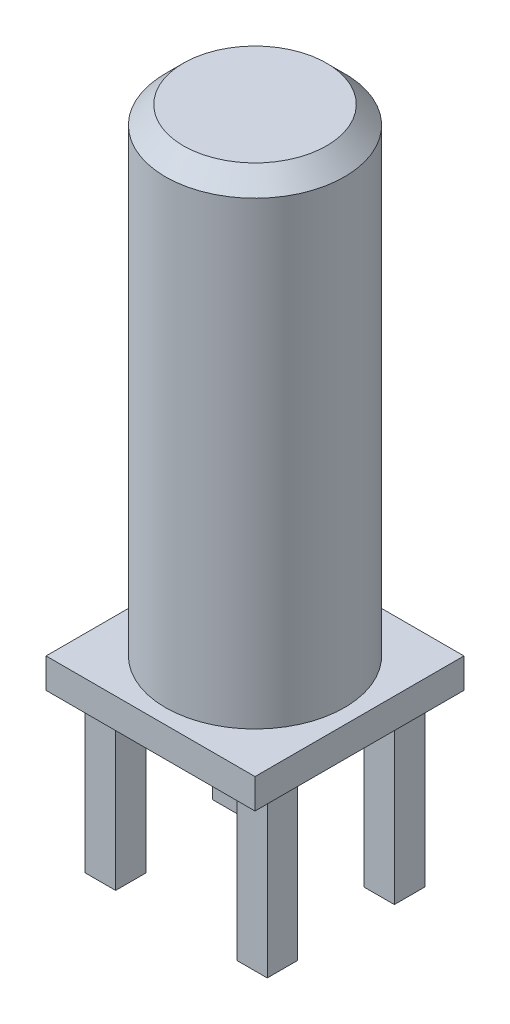
ISO-10303-21;
HEADER;
FILE_DESCRIPTION(('STEP AP214'),'2;1');
FILE_NAME('part.step','',(''),(''),'','','');
FILE_SCHEMA(('AUTOMOTIVE_DESIGN { 1 0 10303 214 1 1 1 1 }'));
ENDSEC;
DATA;
#1=APPLICATION_CONTEXT('core data for automotive mechanical design processes');
#2=APPLICATION_PROTOCOL_DEFINITION('international standard','automotive_design',2000,#1);
#3=PRODUCT_CONTEXT('',#1,'mechanical');
#4=PRODUCT('Part','Part','',(#3));
#5=PRODUCT_RELATED_PRODUCT_CATEGORY('part','',(#4));
#6=PRODUCT_DEFINITION_FORMATION('','',#4);
#7=PRODUCT_DEFINITION_CONTEXT('part definition',#1,'design');
#8=PRODUCT_DEFINITION('design','',#6,#7);
#9=PRODUCT_DEFINITION_SHAPE('','',#8);
#10=(LENGTH_UNIT() NAMED_UNIT(*) SI_UNIT(.MILLI.,.METRE.));
#11=(NAMED_UNIT(*) PLANE_ANGLE_UNIT() SI_UNIT($,.RADIAN.));
#12=(NAMED_UNIT(*) SI_UNIT($,.STERADIAN.) SOLID_ANGLE_UNIT());
#13=UNCERTAINTY_MEASURE_WITH_UNIT(LENGTH_MEASURE(1.E-05),#10,'distance_accuracy_value','');
#14=(GEOMETRIC_REPRESENTATION_CONTEXT(3) GLOBAL_UNCERTAINTY_ASSIGNED_CONTEXT((#13)) GLOBAL_UNIT_ASSIGNED_CONTEXT((#10,
#11,#12)) REPRESENTATION_CONTEXT('',''));
#15=CARTESIAN_POINT('',(0.,0.,0.));
#16=DIRECTION('',(0.,0.,1.));
#17=DIRECTION('',(1.,0.,0.));
#18=AXIS2_PLACEMENT_3D('',#15,#16,#17);
#19=CARTESIAN_POINT('',(0.,0.,0.));
#20=DIRECTION('',(0.,1.,0.));
#21=DIRECTION('',(0.,0.,1.));
#22=AXIS2_PLACEMENT_3D('',#19,#20,#21);
#23=PLANE('',#22);
#24=DIRECTION('',(0.,0.,-1.));
#25=VECTOR('',#24,1.);
#26=CARTESIAN_POINT('',(2.03,0.,2.6395086139136));
#27=LINE('',#26,#25);
#28=CARTESIAN_POINT('',(2.03,0.,2.6395086139136));
#29=VERTEX_POINT('',#28);
#30=CARTESIAN_POINT('',(2.03,0.,1.6195086139136));
#31=VERTEX_POINT('',#30);
#32=EDGE_CURVE('E204',#29,#31,#27,.T.);
#33=ORIENTED_EDGE('',*,*,#32,.F.);
#34=DIRECTION('',(-1.,0.,0.));
#35=VECTOR('',#34,1.);
#36=CARTESIAN_POINT('',(2.03,0.,2.6395086139136));
#37=LINE('',#36,#35);
#38=CARTESIAN_POINT('',(3.05,0.,2.6395086139136));
#39=VERTEX_POINT('',#38);
#40=EDGE_CURVE('E217',#39,#29,#37,.T.);
#41=ORIENTED_EDGE('',*,*,#40,.F.);
#42=DIRECTION('',(0.,0.,1.));
#43=VECTOR('',#42,1.);
#44=CARTESIAN_POINT('',(3.05,0.,2.6395086139136));
#45=LINE('',#44,#43);
#46=CARTESIAN_POINT('',(3.05,0.,1.6195086139136));
#47=VERTEX_POINT('',#46);
#48=EDGE_CURVE('E226',#47,#39,#45,.T.);
#49=ORIENTED_EDGE('',*,*,#48,.F.);
#50=DIRECTION('',(1.,0.,0.));
#51=VECTOR('',#50,1.);
#52=CARTESIAN_POINT('',(2.03,0.,1.6195086139136));
#53=LINE('',#52,#51);
#54=EDGE_CURVE('E207',#31,#47,#53,.T.);
#55=ORIENTED_EDGE('',*,*,#54,.F.);
#56=EDGE_LOOP('',(#33,#41,#49,#55));
#57=FACE_BOUND('',#56,.T.);
#58=DIRECTION('',(0.,0.,-1.));
#59=VECTOR('',#58,1.);
#60=CARTESIAN_POINT('',(-3.05,0.,2.6395086139136));
#61=LINE('',#60,#59);
#62=CARTESIAN_POINT('',(-3.05,0.,2.6395086139136));
#63=VERTEX_POINT('',#62);
#64=CARTESIAN_POINT('',(-3.05,0.,1.6195086139136));
#65=VERTEX_POINT('',#64);
#66=EDGE_CURVE('E275',#63,#65,#61,.T.);
#67=ORIENTED_EDGE('',*,*,#66,.F.);
#68=DIRECTION('',(-1.,0.,0.));
#69=VECTOR('',#68,1.);
#70=CARTESIAN_POINT('',(-3.05,0.,2.6395086139136));
#71=LINE('',#70,#69);
#72=CARTESIAN_POINT('',(-2.03,0.,2.6395086139136));
#73=VERTEX_POINT('',#72);
#74=EDGE_CURVE('E280',#73,#63,#71,.T.);
#75=ORIENTED_EDGE('',*,*,#74,.F.);
#76=DIRECTION('',(0.,0.,1.));
#77=VECTOR('',#76,1.);
#78=CARTESIAN_POINT('',(-2.03,0.,2.6395086139136));
#79=LINE('',#78,#77);
#80=CARTESIAN_POINT('',(-2.03,0.,1.6195086139136));
#81=VERTEX_POINT('',#80);
#82=EDGE_CURVE('E292',#81,#73,#79,.T.);
#83=ORIENTED_EDGE('',*,*,#82,.F.);
#84=DIRECTION('',(1.,0.,0.));
#85=VECTOR('',#84,1.);
#86=CARTESIAN_POINT('',(-3.05,0.,1.6195086139136));
#87=LINE('',#86,#85);
#88=EDGE_CURVE('E289',#65,#81,#87,.T.);
#89=ORIENTED_EDGE('',*,*,#88,.F.);
#90=EDGE_LOOP('',(#67,#75,#83,#89));
#91=FACE_BOUND('',#90,.T.);
#92=DIRECTION('',(0.,0.,-1.));
#93=VECTOR('',#92,1.);
#94=CARTESIAN_POINT('',(3.5,0.,-3.5));
#95=LINE('',#94,#93);
#96=CARTESIAN_POINT('',(3.5,0.,3.5));
#97=VERTEX_POINT('',#96);
#98=CARTESIAN_POINT('',(3.5,0.,-3.5));
#99=VERTEX_POINT('',#98);
#100=EDGE_CURVE('E308',#97,#99,#95,.T.);
#101=ORIENTED_EDGE('',*,*,#100,.F.);
#102=DIRECTION('',(1.,0.,0.));
#103=VECTOR('',#102,1.);
#104=CARTESIAN_POINT('',(-3.5,0.,3.5));
#105=LINE('',#104,#103);
#106=CARTESIAN_POINT('',(-3.5,0.,3.5));
#107=VERTEX_POINT('',#106);
#108=EDGE_CURVE('E313',#107,#97,#105,.T.);
#109=ORIENTED_EDGE('',*,*,#108,.F.);
#110=DIRECTION('',(0.,0.,1.));
#111=VECTOR('',#110,1.);
#112=CARTESIAN_POINT('',(-3.5,0.,-3.5));
#113=LINE('',#112,#111);
#114=CARTESIAN_POINT('',(-3.5,0.,-3.5));
#115=VERTEX_POINT('',#114);
#116=EDGE_CURVE('E324',#115,#107,#113,.T.);
#117=ORIENTED_EDGE('',*,*,#116,.F.);
#118=DIRECTION('',(-1.,0.,0.));
#119=VECTOR('',#118,1.);
#120=CARTESIAN_POINT('',(-3.5,0.,-3.5));
#121=LINE('',#120,#119);
#122=EDGE_CURVE('E322',#99,#115,#121,.T.);
#123=ORIENTED_EDGE('',*,*,#122,.F.);
#124=EDGE_LOOP('',(#101,#109,#117,#123));
#125=FACE_BOUND('',#124,.T.);
#126=DIRECTION('',(0.,0.,-1.));
#127=VECTOR('',#126,1.);
#128=CARTESIAN_POINT('',(-3.05,0.,-1.6195086139136));
#129=LINE('',#128,#127);
#130=CARTESIAN_POINT('',(-3.05,0.,-1.6195086139136));
#131=VERTEX_POINT('',#130);
#132=CARTESIAN_POINT('',(-3.05,0.,-2.6395086139136));
#133=VERTEX_POINT('',#132);
#134=EDGE_CURVE('E242',#131,#133,#129,.T.);
#135=ORIENTED_EDGE('',*,*,#134,.F.);
#136=DIRECTION('',(-1.,0.,0.));
#137=VECTOR('',#136,1.);
#138=CARTESIAN_POINT('',(-3.05,0.,-1.6195086139136));
#139=LINE('',#138,#137);
#140=CARTESIAN_POINT('',(-2.03,0.,-1.6195086139136));
#141=VERTEX_POINT('',#140);
#142=EDGE_CURVE('E247',#141,#131,#139,.T.);
#143=ORIENTED_EDGE('',*,*,#142,.F.);
#144=DIRECTION('',(0.,0.,1.));
#145=VECTOR('',#144,1.);
#146=CARTESIAN_POINT('',(-2.03,0.,-1.6195086139136));
#147=LINE('',#146,#145);
#148=CARTESIAN_POINT('',(-2.03,0.,-2.6395086139136));
#149=VERTEX_POINT('',#148);
#150=EDGE_CURVE('E259',#149,#141,#147,.T.);
#151=ORIENTED_EDGE('',*,*,#150,.F.);
#152=DIRECTION('',(1.,0.,0.));
#153=VECTOR('',#152,1.);
#154=CARTESIAN_POINT('',(-3.05,0.,-2.6395086139136));
#155=LINE('',#154,#153);
#156=EDGE_CURVE('E256',#133,#149,#155,.T.);
#157=ORIENTED_EDGE('',*,*,#156,.F.);
#158=EDGE_LOOP('',(#135,#143,#151,#157));
#159=FACE_BOUND('',#158,.T.);
#160=DIRECTION('',(0.,0.,-1.));
#161=VECTOR('',#160,1.);
#162=CARTESIAN_POINT('',(2.03,0.,-1.6195086139136));
#163=LINE('',#162,#161);
#164=CARTESIAN_POINT('',(2.03,0.,-1.6195086139136));
#165=VERTEX_POINT('',#164);
#166=CARTESIAN_POINT('',(2.03,0.,-2.6395086139136));
#167=VERTEX_POINT('',#166);
#168=EDGE_CURVE('E203',#165,#167,#163,.T.);
#169=ORIENTED_EDGE('',*,*,#168,.F.);
#170=DIRECTION('',(-1.,0.,0.));
#171=VECTOR('',#170,1.);
#172=CARTESIAN_POINT('',(2.03,0.,-1.6195086139136));
#173=LINE('',#172,#171);
#174=CARTESIAN_POINT('',(3.05,0.,-1.6195086139136));
#175=VERTEX_POINT('',#174);
#176=EDGE_CURVE('E200',#175,#165,#173,.T.);
#177=ORIENTED_EDGE('',*,*,#176,.F.);
#178=DIRECTION('',(0.,0.,1.));
#179=VECTOR('',#178,1.);
#180=CARTESIAN_POINT('',(3.05,0.,-1.6195086139136));
#181=LINE('',#180,#179);
#182=CARTESIAN_POINT('',(3.05,0.,-2.6395086139136));
#183=VERTEX_POINT('',#182);
#184=EDGE_CURVE('E66',#183,#175,#181,.T.);
#185=ORIENTED_EDGE('',*,*,#184,.F.);
#186=DIRECTION('',(1.,0.,0.));
#187=VECTOR('',#186,1.);
#188=CARTESIAN_POINT('',(2.03,0.,-2.6395086139136));
#189=LINE('',#188,#187);
#190=EDGE_CURVE('E61',#167,#183,#189,.T.);
#191=ORIENTED_EDGE('',*,*,#190,.F.);
#192=EDGE_LOOP('',(#169,#177,#185,#191));
#193=FACE_BOUND('',#192,.T.);
#194=ADVANCED_FACE('F46',(#57,#91,#125,#159,#193),#23,.F.);
#195=CARTESIAN_POINT('',(3.5,1.,-3.5));
#196=DIRECTION('',(-1.,0.,0.));
#197=DIRECTION('',(0.,0.,1.));
#198=AXIS2_PLACEMENT_3D('',#195,#196,#197);
#199=PLANE('',#198);
#200=ORIENTED_EDGE('',*,*,#100,.T.);
#201=DIRECTION('',(0.,-1.,0.));
#202=VECTOR('',#201,1.);
#203=CARTESIAN_POINT('',(3.5,1.,-3.5));
#204=LINE('',#203,#202);
#205=CARTESIAN_POINT('',(3.5,1.,-3.5));
#206=VERTEX_POINT('',#205);
#207=EDGE_CURVE('E335',#206,#99,#204,.T.);
#208=ORIENTED_EDGE('',*,*,#207,.F.);
#209=DIRECTION('',(0.,0.,-1.));
#210=VECTOR('',#209,1.);
#211=CARTESIAN_POINT('',(3.5,1.,-3.5));
#212=LINE('',#211,#210);
#213=CARTESIAN_POINT('',(3.5,1.,3.5));
#214=VERTEX_POINT('',#213);
#215=EDGE_CURVE('E309',#214,#206,#212,.T.);
#216=ORIENTED_EDGE('',*,*,#215,.F.);
#217=DIRECTION('',(0.,-1.,0.));
#218=VECTOR('',#217,1.);
#219=CARTESIAN_POINT('',(3.5,1.,3.5));
#220=LINE('',#219,#218);
#221=EDGE_CURVE('E319',#214,#97,#220,.T.);
#222=ORIENTED_EDGE('',*,*,#221,.T.);
#223=EDGE_LOOP('',(#200,#208,#216,#222));
#224=FACE_BOUND('',#223,.T.);
#225=ADVANCED_FACE('F369',(#224),#199,.F.);
#226=CARTESIAN_POINT('',(-3.5,1.,-3.5));
#227=DIRECTION('',(0.,0.,1.));
#228=DIRECTION('',(1.,0.,0.));
#229=AXIS2_PLACEMENT_3D('',#226,#227,#228);
#230=PLANE('',#229);
#231=ORIENTED_EDGE('',*,*,#122,.T.);
#232=DIRECTION('',(0.,-1.,0.));
#233=VECTOR('',#232,1.);
#234=CARTESIAN_POINT('',(-3.5,1.,-3.5));
#235=LINE('',#234,#233);
#236=CARTESIAN_POINT('',(-3.5,1.,-3.5));
#237=VERTEX_POINT('',#236);
#238=EDGE_CURVE('E332',#237,#115,#235,.T.);
#239=ORIENTED_EDGE('',*,*,#238,.F.);
#240=DIRECTION('',(-1.,0.,0.));
#241=VECTOR('',#240,1.);
#242=CARTESIAN_POINT('',(-3.5,1.,-3.5));
#243=LINE('',#242,#241);
#244=EDGE_CURVE('E312',#206,#237,#243,.T.);
#245=ORIENTED_EDGE('',*,*,#244,.F.);
#246=ORIENTED_EDGE('',*,*,#207,.T.);
#247=EDGE_LOOP('',(#231,#239,#245,#246));
#248=FACE_BOUND('',#247,.T.);
#249=ADVANCED_FACE('F375',(#248),#230,.F.);
#250=CARTESIAN_POINT('',(-3.5,1.,-3.5));
#251=DIRECTION('',(1.,0.,0.));
#252=DIRECTION('',(0.,0.,-1.));
#253=AXIS2_PLACEMENT_3D('',#250,#251,#252);
#254=PLANE('',#253);
#255=ORIENTED_EDGE('',*,*,#116,.T.);
#256=DIRECTION('',(0.,-1.,0.));
#257=VECTOR('',#256,1.);
#258=CARTESIAN_POINT('',(-3.5,1.,3.5));
#259=LINE('',#258,#257);
#260=CARTESIAN_POINT('',(-3.5,1.,3.5));
#261=VERTEX_POINT('',#260);
#262=EDGE_CURVE('E329',#261,#107,#259,.T.);
#263=ORIENTED_EDGE('',*,*,#262,.F.);
#264=DIRECTION('',(0.,0.,1.));
#265=VECTOR('',#264,1.);
#266=CARTESIAN_POINT('',(-3.5,1.,-3.5));
#267=LINE('',#266,#265);
#268=EDGE_CURVE('E315',#237,#261,#267,.T.);
#269=ORIENTED_EDGE('',*,*,#268,.F.);
#270=ORIENTED_EDGE('',*,*,#238,.T.);
#271=EDGE_LOOP('',(#255,#263,#269,#270));
#272=FACE_BOUND('',#271,.T.);
#273=ADVANCED_FACE('F385',(#272),#254,.F.);
#274=CARTESIAN_POINT('',(-3.5,1.,3.5));
#275=DIRECTION('',(0.,0.,-1.));
#276=DIRECTION('',(-1.,0.,0.));
#277=AXIS2_PLACEMENT_3D('',#274,#275,#276);
#278=PLANE('',#277);
#279=ORIENTED_EDGE('',*,*,#108,.T.);
#280=ORIENTED_EDGE('',*,*,#221,.F.);
#281=DIRECTION('',(1.,0.,0.));
#282=VECTOR('',#281,1.);
#283=CARTESIAN_POINT('',(-3.5,1.,3.5));
#284=LINE('',#283,#282);
#285=EDGE_CURVE('E317',#261,#214,#284,.T.);
#286=ORIENTED_EDGE('',*,*,#285,.F.);
#287=ORIENTED_EDGE('',*,*,#262,.T.);
#288=EDGE_LOOP('',(#279,#280,#286,#287));
#289=FACE_BOUND('',#288,.T.);
#290=ADVANCED_FACE('F382',(#289),#278,.F.);
#291=CARTESIAN_POINT('',(0.,1.,0.));
#292=DIRECTION('',(0.,1.,0.));
#293=DIRECTION('',(0.,0.,1.));
#294=AXIS2_PLACEMENT_3D('',#291,#292,#293);
#295=PLANE('',#294);
#296=CARTESIAN_POINT('',(0.,1.,0.));
#297=DIRECTION('',(0.,1.,0.));
#298=DIRECTION('',(0.,0.,1.));
#299=AXIS2_PLACEMENT_3D('',#296,#297,#298);
#300=CIRCLE('',#299,3.);
#301=CARTESIAN_POINT('',(0.,1.,3.));
#302=VERTEX_POINT('',#301);
#303=EDGE_CURVE('E337',#302,#302,#300,.T.);
#304=ORIENTED_EDGE('',*,*,#303,.F.);
#305=EDGE_LOOP('',(#304));
#306=FACE_BOUND('',#305,.T.);
#307=ORIENTED_EDGE('',*,*,#215,.T.);
#308=ORIENTED_EDGE('',*,*,#244,.T.);
#309=ORIENTED_EDGE('',*,*,#268,.T.);
#310=ORIENTED_EDGE('',*,*,#285,.T.);
#311=EDGE_LOOP('',(#307,#308,#309,#310));
#312=FACE_BOUND('',#311,.T.);
#313=ADVANCED_FACE('F380',(#306,#312),#295,.T.);
#314=CARTESIAN_POINT('',(-3.05,-5.5,2.6395086139136));
#315=DIRECTION('',(1.,0.,0.));
#316=DIRECTION('',(0.,0.,-1.));
#317=AXIS2_PLACEMENT_3D('',#314,#315,#316);
#318=PLANE('',#317);
#319=ORIENTED_EDGE('',*,*,#66,.T.);
#320=DIRECTION('',(0.,1.,0.));
#321=VECTOR('',#320,1.);
#322=CARTESIAN_POINT('',(-3.05,-5.5,1.6195086139136));
#323=LINE('',#322,#321);
#324=CARTESIAN_POINT('',(-3.05,-5.5,1.6195086139136));
#325=VERTEX_POINT('',#324);
#326=EDGE_CURVE('E305',#325,#65,#323,.T.);
#327=ORIENTED_EDGE('',*,*,#326,.F.);
#328=DIRECTION('',(0.,0.,-1.));
#329=VECTOR('',#328,1.);
#330=CARTESIAN_POINT('',(-3.05,-5.5,2.6395086139136));
#331=LINE('',#330,#329);
#332=CARTESIAN_POINT('',(-3.05,-5.5,2.6395086139136));
#333=VERTEX_POINT('',#332);
#334=EDGE_CURVE('E276',#333,#325,#331,.T.);
#335=ORIENTED_EDGE('',*,*,#334,.F.);
#336=DIRECTION('',(0.,1.,0.));
#337=VECTOR('',#336,1.);
#338=CARTESIAN_POINT('',(-3.05,-5.5,2.6395086139136));
#339=LINE('',#338,#337);
#340=EDGE_CURVE('E286',#333,#63,#339,.T.);
#341=ORIENTED_EDGE('',*,*,#340,.T.);
#342=EDGE_LOOP('',(#319,#327,#335,#341));
#343=FACE_BOUND('',#342,.T.);
#344=ADVANCED_FACE('F408',(#343),#318,.F.);
#345=CARTESIAN_POINT('',(-3.05,-5.5,1.6195086139136));
#346=DIRECTION('',(0.,0.,1.));
#347=DIRECTION('',(1.,0.,0.));
#348=AXIS2_PLACEMENT_3D('',#345,#346,#347);
#349=PLANE('',#348);
#350=ORIENTED_EDGE('',*,*,#88,.T.);
#351=DIRECTION('',(0.,1.,0.));
#352=VECTOR('',#351,1.);
#353=CARTESIAN_POINT('',(-2.03,-5.5,1.6195086139136));
#354=LINE('',#353,#352);
#355=CARTESIAN_POINT('',(-2.03,-5.5,1.6195086139136));
#356=VERTEX_POINT('',#355);
#357=EDGE_CURVE('E302',#356,#81,#354,.T.);
#358=ORIENTED_EDGE('',*,*,#357,.F.);
#359=DIRECTION('',(1.,0.,0.));
#360=VECTOR('',#359,1.);
#361=CARTESIAN_POINT('',(-3.05,-5.5,1.6195086139136));
#362=LINE('',#361,#360);
#363=EDGE_CURVE('E279',#325,#356,#362,.T.);
#364=ORIENTED_EDGE('',*,*,#363,.F.);
#365=ORIENTED_EDGE('',*,*,#326,.T.);
#366=EDGE_LOOP('',(#350,#358,#364,#365));
#367=FACE_BOUND('',#366,.T.);
#368=ADVANCED_FACE('F413',(#367),#349,.F.);
#369=CARTESIAN_POINT('',(-2.03,-5.5,2.6395086139136));
#370=DIRECTION('',(-1.,0.,0.));
#371=DIRECTION('',(0.,0.,1.));
#372=AXIS2_PLACEMENT_3D('',#369,#370,#371);
#373=PLANE('',#372);
#374=ORIENTED_EDGE('',*,*,#82,.T.);
#375=DIRECTION('',(0.,1.,0.));
#376=VECTOR('',#375,1.);
#377=CARTESIAN_POINT('',(-2.03,-5.5,2.6395086139136));
#378=LINE('',#377,#376);
#379=CARTESIAN_POINT('',(-2.03,-5.5,2.6395086139136));
#380=VERTEX_POINT('',#379);
#381=EDGE_CURVE('E299',#380,#73,#378,.T.);
#382=ORIENTED_EDGE('',*,*,#381,.F.);
#383=DIRECTION('',(0.,0.,1.));
#384=VECTOR('',#383,1.);
#385=CARTESIAN_POINT('',(-2.03,-5.5,2.6395086139136));
#386=LINE('',#385,#384);
#387=EDGE_CURVE('E282',#356,#380,#386,.T.);
#388=ORIENTED_EDGE('',*,*,#387,.F.);
#389=ORIENTED_EDGE('',*,*,#357,.T.);
#390=EDGE_LOOP('',(#374,#382,#388,#389));
#391=FACE_BOUND('',#390,.T.);
#392=ADVANCED_FACE('F418',(#391),#373,.F.);
#393=CARTESIAN_POINT('',(-3.05,-5.5,2.6395086139136));
#394=DIRECTION('',(0.,0.,-1.));
#395=DIRECTION('',(-1.,0.,0.));
#396=AXIS2_PLACEMENT_3D('',#393,#394,#395);
#397=PLANE('',#396);
#398=ORIENTED_EDGE('',*,*,#74,.T.);
#399=ORIENTED_EDGE('',*,*,#340,.F.);
#400=DIRECTION('',(-1.,0.,0.));
#401=VECTOR('',#400,1.);
#402=CARTESIAN_POINT('',(-3.05,-5.5,2.6395086139136));
#403=LINE('',#402,#401);
#404=EDGE_CURVE('E284',#380,#333,#403,.T.);
#405=ORIENTED_EDGE('',*,*,#404,.F.);
#406=ORIENTED_EDGE('',*,*,#381,.T.);
#407=EDGE_LOOP('',(#398,#399,#405,#406));
#408=FACE_BOUND('',#407,.T.);
#409=ADVANCED_FACE('F424',(#408),#397,.F.);
#410=CARTESIAN_POINT('',(0.,-5.5,0.));
#411=DIRECTION('',(0.,-1.,0.));
#412=DIRECTION('',(0.,0.,-1.));
#413=AXIS2_PLACEMENT_3D('',#410,#411,#412);
#414=PLANE('',#413);
#415=ORIENTED_EDGE('',*,*,#334,.T.);
#416=ORIENTED_EDGE('',*,*,#363,.T.);
#417=ORIENTED_EDGE('',*,*,#387,.T.);
#418=ORIENTED_EDGE('',*,*,#404,.T.);
#419=EDGE_LOOP('',(#415,#416,#417,#418));
#420=FACE_BOUND('',#419,.T.);
#421=ADVANCED_FACE('F428',(#420),#414,.T.);
#422=CARTESIAN_POINT('',(-3.05,-5.5,-1.6195086139136));
#423=DIRECTION('',(1.,0.,0.));
#424=DIRECTION('',(0.,0.,-1.));
#425=AXIS2_PLACEMENT_3D('',#422,#423,#424);
#426=PLANE('',#425);
#427=ORIENTED_EDGE('',*,*,#134,.T.);
#428=DIRECTION('',(0.,1.,0.));
#429=VECTOR('',#428,1.);
#430=CARTESIAN_POINT('',(-3.05,-5.5,-2.6395086139136));
#431=LINE('',#430,#429);
#432=CARTESIAN_POINT('',(-3.05,-5.5,-2.6395086139136));
#433=VERTEX_POINT('',#432);
#434=EDGE_CURVE('E272',#433,#133,#431,.T.);
#435=ORIENTED_EDGE('',*,*,#434,.F.);
#436=DIRECTION('',(0.,0.,-1.));
#437=VECTOR('',#436,1.);
#438=CARTESIAN_POINT('',(-3.05,-5.5,-1.6195086139136));
#439=LINE('',#438,#437);
#440=CARTESIAN_POINT('',(-3.05,-5.5,-1.6195086139136));
#441=VERTEX_POINT('',#440);
#442=EDGE_CURVE('E243',#441,#433,#439,.T.);
#443=ORIENTED_EDGE('',*,*,#442,.F.);
#444=DIRECTION('',(0.,1.,0.));
#445=VECTOR('',#444,1.);
#446=CARTESIAN_POINT('',(-3.05,-5.5,-1.6195086139136));
#447=LINE('',#446,#445);
#448=EDGE_CURVE('E253',#441,#131,#447,.T.);
#449=ORIENTED_EDGE('',*,*,#448,.T.);
#450=EDGE_LOOP('',(#427,#435,#443,#449));
#451=FACE_BOUND('',#450,.T.);
#452=ADVANCED_FACE('F432',(#451),#426,.F.);
#453=CARTESIAN_POINT('',(-3.05,-5.5,-2.6395086139136));
#454=DIRECTION('',(0.,0.,1.));
#455=DIRECTION('',(1.,0.,0.));
#456=AXIS2_PLACEMENT_3D('',#453,#454,#455);
#457=PLANE('',#456);
#458=ORIENTED_EDGE('',*,*,#156,.T.);
#459=DIRECTION('',(0.,1.,0.));
#460=VECTOR('',#459,1.);
#461=CARTESIAN_POINT('',(-2.03,-5.5,-2.6395086139136));
#462=LINE('',#461,#460);
#463=CARTESIAN_POINT('',(-2.03,-5.5,-2.6395086139136));
#464=VERTEX_POINT('',#463);
#465=EDGE_CURVE('E269',#464,#149,#462,.T.);
#466=ORIENTED_EDGE('',*,*,#465,.F.);
#467=DIRECTION('',(1.,0.,0.));
#468=VECTOR('',#467,1.);
#469=CARTESIAN_POINT('',(-3.05,-5.5,-2.6395086139136));
#470=LINE('',#469,#468);
#471=EDGE_CURVE('E246',#433,#464,#470,.T.);
#472=ORIENTED_EDGE('',*,*,#471,.F.);
#473=ORIENTED_EDGE('',*,*,#434,.T.);
#474=EDGE_LOOP('',(#458,#466,#472,#473));
#475=FACE_BOUND('',#474,.T.);
#476=ADVANCED_FACE('F436',(#475),#457,.F.);
#477=CARTESIAN_POINT('',(-2.03,-5.5,-1.6195086139136));
#478=DIRECTION('',(-1.,0.,0.));
#479=DIRECTION('',(0.,0.,1.));
#480=AXIS2_PLACEMENT_3D('',#477,#478,#479);
#481=PLANE('',#480);
#482=ORIENTED_EDGE('',*,*,#150,.T.);
#483=DIRECTION('',(0.,1.,0.));
#484=VECTOR('',#483,1.);
#485=CARTESIAN_POINT('',(-2.03,-5.5,-1.6195086139136));
#486=LINE('',#485,#484);
#487=CARTESIAN_POINT('',(-2.03,-5.5,-1.6195086139136));
#488=VERTEX_POINT('',#487);
#489=EDGE_CURVE('E266',#488,#141,#486,.T.);
#490=ORIENTED_EDGE('',*,*,#489,.F.);
#491=DIRECTION('',(0.,0.,1.));
#492=VECTOR('',#491,1.);
#493=CARTESIAN_POINT('',(-2.03,-5.5,-1.6195086139136));
#494=LINE('',#493,#492);
#495=EDGE_CURVE('E249',#464,#488,#494,.T.);
#496=ORIENTED_EDGE('',*,*,#495,.F.);
#497=ORIENTED_EDGE('',*,*,#465,.T.);
#498=EDGE_LOOP('',(#482,#490,#496,#497));
#499=FACE_BOUND('',#498,.T.);
#500=ADVANCED_FACE('F440',(#499),#481,.F.);
#501=CARTESIAN_POINT('',(-3.05,-5.5,-1.6195086139136));
#502=DIRECTION('',(0.,0.,-1.));
#503=DIRECTION('',(-1.,0.,0.));
#504=AXIS2_PLACEMENT_3D('',#501,#502,#503);
#505=PLANE('',#504);
#506=ORIENTED_EDGE('',*,*,#142,.T.);
#507=ORIENTED_EDGE('',*,*,#448,.F.);
#508=DIRECTION('',(-1.,0.,0.));
#509=VECTOR('',#508,1.);
#510=CARTESIAN_POINT('',(-3.05,-5.5,-1.6195086139136));
#511=LINE('',#510,#509);
#512=EDGE_CURVE('E251',#488,#441,#511,.T.);
#513=ORIENTED_EDGE('',*,*,#512,.F.);
#514=ORIENTED_EDGE('',*,*,#489,.T.);
#515=EDGE_LOOP('',(#506,#507,#513,#514));
#516=FACE_BOUND('',#515,.T.);
#517=ADVANCED_FACE('F444',(#516),#505,.F.);
#518=CARTESIAN_POINT('',(0.,-5.5,0.));
#519=DIRECTION('',(0.,-1.,0.));
#520=DIRECTION('',(0.,0.,-1.));
#521=AXIS2_PLACEMENT_3D('',#518,#519,#520);
#522=PLANE('',#521);
#523=ORIENTED_EDGE('',*,*,#442,.T.);
#524=ORIENTED_EDGE('',*,*,#471,.T.);
#525=ORIENTED_EDGE('',*,*,#495,.T.);
#526=ORIENTED_EDGE('',*,*,#512,.T.);
#527=EDGE_LOOP('',(#523,#524,#525,#526));
#528=FACE_BOUND('',#527,.T.);
#529=ADVANCED_FACE('F448',(#528),#522,.T.);
#530=CARTESIAN_POINT('',(2.03,-5.5,2.6395086139136));
#531=DIRECTION('',(1.,0.,0.));
#532=DIRECTION('',(0.,0.,-1.));
#533=AXIS2_PLACEMENT_3D('',#530,#531,#532);
#534=PLANE('',#533);
#535=ORIENTED_EDGE('',*,*,#32,.T.);
#536=DIRECTION('',(0.,1.,0.));
#537=VECTOR('',#536,1.);
#538=CARTESIAN_POINT('',(2.03,-5.5,1.6195086139136));
#539=LINE('',#538,#537);
#540=CARTESIAN_POINT('',(2.03,-5.5,1.6195086139136));
#541=VERTEX_POINT('',#540);
#542=EDGE_CURVE('E239',#541,#31,#539,.T.);
#543=ORIENTED_EDGE('',*,*,#542,.F.);
#544=DIRECTION('',(0.,0.,-1.));
#545=VECTOR('',#544,1.);
#546=CARTESIAN_POINT('',(2.03,-5.5,2.6395086139136));
#547=LINE('',#546,#545);
#548=CARTESIAN_POINT('',(2.03,-5.5,2.6395086139136));
#549=VERTEX_POINT('',#548);
#550=EDGE_CURVE('E213',#549,#541,#547,.T.);
#551=ORIENTED_EDGE('',*,*,#550,.F.);
#552=DIRECTION('',(0.,1.,0.));
#553=VECTOR('',#552,1.);
#554=CARTESIAN_POINT('',(2.03,-5.5,2.6395086139136));
#555=LINE('',#554,#553);
#556=EDGE_CURVE('E222',#549,#29,#555,.T.);
#557=ORIENTED_EDGE('',*,*,#556,.T.);
#558=EDGE_LOOP('',(#535,#543,#551,#557));
#559=FACE_BOUND('',#558,.T.);
#560=ADVANCED_FACE('F452',(#559),#534,.F.);
#561=CARTESIAN_POINT('',(2.03,-5.5,1.6195086139136));
#562=DIRECTION('',(0.,0.,1.));
#563=DIRECTION('',(1.,0.,0.));
#564=AXIS2_PLACEMENT_3D('',#561,#562,#563);
#565=PLANE('',#564);
#566=ORIENTED_EDGE('',*,*,#54,.T.);
#567=DIRECTION('',(0.,1.,0.));
#568=VECTOR('',#567,1.);
#569=CARTESIAN_POINT('',(3.05,-5.5,1.6195086139136));
#570=LINE('',#569,#568);
#571=CARTESIAN_POINT('',(3.05,-5.5,1.6195086139136));
#572=VERTEX_POINT('',#571);
#573=EDGE_CURVE('E236',#572,#47,#570,.T.);
#574=ORIENTED_EDGE('',*,*,#573,.F.);
#575=DIRECTION('',(1.,0.,0.));
#576=VECTOR('',#575,1.);
#577=CARTESIAN_POINT('',(2.03,-5.5,1.6195086139136));
#578=LINE('',#577,#576);
#579=EDGE_CURVE('E216',#541,#572,#578,.T.);
#580=ORIENTED_EDGE('',*,*,#579,.F.);
#581=ORIENTED_EDGE('',*,*,#542,.T.);
#582=EDGE_LOOP('',(#566,#574,#580,#581));
#583=FACE_BOUND('',#582,.T.);
#584=ADVANCED_FACE('F456',(#583),#565,.F.);
#585=CARTESIAN_POINT('',(3.05,-5.5,2.6395086139136));
#586=DIRECTION('',(-1.,0.,0.));
#587=DIRECTION('',(0.,0.,1.));
#588=AXIS2_PLACEMENT_3D('',#585,#586,#587);
#589=PLANE('',#588);
#590=ORIENTED_EDGE('',*,*,#48,.T.);
#591=DIRECTION('',(0.,1.,0.));
#592=VECTOR('',#591,1.);
#593=CARTESIAN_POINT('',(3.05,-5.5,2.6395086139136));
#594=LINE('',#593,#592);
#595=CARTESIAN_POINT('',(3.05,-5.5,2.6395086139136));
#596=VERTEX_POINT('',#595);
#597=EDGE_CURVE('E233',#596,#39,#594,.T.);
#598=ORIENTED_EDGE('',*,*,#597,.F.);
#599=DIRECTION('',(0.,0.,1.));
#600=VECTOR('',#599,1.);
#601=CARTESIAN_POINT('',(3.05,-5.5,2.6395086139136));
#602=LINE('',#601,#600);
#603=EDGE_CURVE('E219',#572,#596,#602,.T.);
#604=ORIENTED_EDGE('',*,*,#603,.F.);
#605=ORIENTED_EDGE('',*,*,#573,.T.);
#606=EDGE_LOOP('',(#590,#598,#604,#605));
#607=FACE_BOUND('',#606,.T.);
#608=ADVANCED_FACE('F460',(#607),#589,.F.);
#609=CARTESIAN_POINT('',(2.03,-5.5,2.6395086139136));
#610=DIRECTION('',(0.,0.,-1.));
#611=DIRECTION('',(-1.,0.,0.));
#612=AXIS2_PLACEMENT_3D('',#609,#610,#611);
#613=PLANE('',#612);
#614=ORIENTED_EDGE('',*,*,#40,.T.);
#615=ORIENTED_EDGE('',*,*,#556,.F.);
#616=DIRECTION('',(-1.,0.,0.));
#617=VECTOR('',#616,1.);
#618=CARTESIAN_POINT('',(2.03,-5.5,2.6395086139136));
#619=LINE('',#618,#617);
#620=EDGE_CURVE('E221',#596,#549,#619,.T.);
#621=ORIENTED_EDGE('',*,*,#620,.F.);
#622=ORIENTED_EDGE('',*,*,#597,.T.);
#623=EDGE_LOOP('',(#614,#615,#621,#622));
#624=FACE_BOUND('',#623,.T.);
#625=ADVANCED_FACE('F464',(#624),#613,.F.);
#626=CARTESIAN_POINT('',(0.,-5.5,0.));
#627=DIRECTION('',(0.,-1.,0.));
#628=DIRECTION('',(0.,0.,-1.));
#629=AXIS2_PLACEMENT_3D('',#626,#627,#628);
#630=PLANE('',#629);
#631=ORIENTED_EDGE('',*,*,#550,.T.);
#632=ORIENTED_EDGE('',*,*,#579,.T.);
#633=ORIENTED_EDGE('',*,*,#603,.T.);
#634=ORIENTED_EDGE('',*,*,#620,.T.);
#635=EDGE_LOOP('',(#631,#632,#633,#634));
#636=FACE_BOUND('',#635,.T.);
#637=ADVANCED_FACE('F468',(#636),#630,.T.);
#638=CARTESIAN_POINT('',(2.03,-5.5,-1.6195086139136));
#639=DIRECTION('',(1.,0.,0.));
#640=DIRECTION('',(0.,0.,-1.));
#641=AXIS2_PLACEMENT_3D('',#638,#639,#640);
#642=PLANE('',#641);
#643=ORIENTED_EDGE('',*,*,#168,.T.);
#644=DIRECTION('',(0.,1.,0.));
#645=VECTOR('',#644,1.);
#646=CARTESIAN_POINT('',(2.03,-5.5,-2.6395086139136));
#647=LINE('',#646,#645);
#648=CARTESIAN_POINT('',(2.03,-5.5,-2.6395086139136));
#649=VERTEX_POINT('',#648);
#650=EDGE_CURVE('E184',#649,#167,#647,.T.);
#651=ORIENTED_EDGE('',*,*,#650,.F.);
#652=DIRECTION('',(0.,0.,-1.));
#653=VECTOR('',#652,1.);
#654=CARTESIAN_POINT('',(2.03,-5.5,-1.6195086139136));
#655=LINE('',#654,#653);
#656=CARTESIAN_POINT('',(2.03,-5.5,-1.6195086139136));
#657=VERTEX_POINT('',#656);
#658=EDGE_CURVE('E191',#657,#649,#655,.T.);
#659=ORIENTED_EDGE('',*,*,#658,.F.);
#660=DIRECTION('',(0.,1.,0.));
#661=VECTOR('',#660,1.);
#662=CARTESIAN_POINT('',(2.03,-5.5,-1.6195086139136));
#663=LINE('',#662,#661);
#664=EDGE_CURVE('E348',#657,#165,#663,.T.);
#665=ORIENTED_EDGE('',*,*,#664,.T.);
#666=EDGE_LOOP('',(#643,#651,#659,#665));
#667=FACE_BOUND('',#666,.T.);
#668=ADVANCED_FACE('F202',(#667),#642,.F.);
#669=CARTESIAN_POINT('',(2.03,-5.5,-2.6395086139136));
#670=DIRECTION('',(0.,0.,1.));
#671=DIRECTION('',(1.,0.,0.));
#672=AXIS2_PLACEMENT_3D('',#669,#670,#671);
#673=PLANE('',#672);
#674=ORIENTED_EDGE('',*,*,#190,.T.);
#675=DIRECTION('',(0.,1.,0.));
#676=VECTOR('',#675,1.);
#677=CARTESIAN_POINT('',(3.05,-5.5,-2.6395086139136));
#678=LINE('',#677,#676);
#679=CARTESIAN_POINT('',(3.05,-5.5,-2.6395086139136));
#680=VERTEX_POINT('',#679);
#681=EDGE_CURVE('E187',#680,#183,#678,.T.);
#682=ORIENTED_EDGE('',*,*,#681,.F.);
#683=DIRECTION('',(1.,0.,0.));
#684=VECTOR('',#683,1.);
#685=CARTESIAN_POINT('',(2.03,-5.5,-2.6395086139136));
#686=LINE('',#685,#684);
#687=EDGE_CURVE('E180',#649,#680,#686,.T.);
#688=ORIENTED_EDGE('',*,*,#687,.F.);
#689=ORIENTED_EDGE('',*,*,#650,.T.);
#690=EDGE_LOOP('',(#674,#682,#688,#689));
#691=FACE_BOUND('',#690,.T.);
#692=ADVANCED_FACE('F182',(#691),#673,.F.);
#693=CARTESIAN_POINT('',(3.05,-5.5,-1.6195086139136));
#694=DIRECTION('',(-1.,0.,0.));
#695=DIRECTION('',(0.,0.,1.));
#696=AXIS2_PLACEMENT_3D('',#693,#694,#695);
#697=PLANE('',#696);
#698=ORIENTED_EDGE('',*,*,#184,.T.);
#699=DIRECTION('',(0.,1.,0.));
#700=VECTOR('',#699,1.);
#701=CARTESIAN_POINT('',(3.05,-5.5,-1.6195086139136));
#702=LINE('',#701,#700);
#703=CARTESIAN_POINT('',(3.05,-5.5,-1.6195086139136));
#704=VERTEX_POINT('',#703);
#705=EDGE_CURVE('E209',#704,#175,#702,.T.);
#706=ORIENTED_EDGE('',*,*,#705,.F.);
#707=DIRECTION('',(0.,0.,1.));
#708=VECTOR('',#707,1.);
#709=CARTESIAN_POINT('',(3.05,-5.5,-1.6195086139136));
#710=LINE('',#709,#708);
#711=EDGE_CURVE('E190',#680,#704,#710,.T.);
#712=ORIENTED_EDGE('',*,*,#711,.F.);
#713=ORIENTED_EDGE('',*,*,#681,.T.);
#714=EDGE_LOOP('',(#698,#706,#712,#713));
#715=FACE_BOUND('',#714,.T.);
#716=ADVANCED_FACE('F359',(#715),#697,.F.);
#717=CARTESIAN_POINT('',(2.03,-5.5,-1.6195086139136));
#718=DIRECTION('',(0.,0.,-1.));
#719=DIRECTION('',(-1.,0.,0.));
#720=AXIS2_PLACEMENT_3D('',#717,#718,#719);
#721=PLANE('',#720);
#722=ORIENTED_EDGE('',*,*,#176,.T.);
#723=ORIENTED_EDGE('',*,*,#664,.F.);
#724=DIRECTION('',(-1.,0.,0.));
#725=VECTOR('',#724,1.);
#726=CARTESIAN_POINT('',(2.03,-5.5,-1.6195086139136));
#727=LINE('',#726,#725);
#728=EDGE_CURVE('E196',#704,#657,#727,.T.);
#729=ORIENTED_EDGE('',*,*,#728,.F.);
#730=ORIENTED_EDGE('',*,*,#705,.T.);
#731=EDGE_LOOP('',(#722,#723,#729,#730));
#732=FACE_BOUND('',#731,.T.);
#733=ADVANCED_FACE('F357',(#732),#721,.F.);
#734=CARTESIAN_POINT('',(0.,-5.5,0.));
#735=DIRECTION('',(0.,-1.,0.));
#736=DIRECTION('',(0.,0.,-1.));
#737=AXIS2_PLACEMENT_3D('',#734,#735,#736);
#738=PLANE('',#737);
#739=ORIENTED_EDGE('',*,*,#658,.T.);
#740=ORIENTED_EDGE('',*,*,#687,.T.);
#741=ORIENTED_EDGE('',*,*,#711,.T.);
#742=ORIENTED_EDGE('',*,*,#728,.T.);
#743=EDGE_LOOP('',(#739,#740,#741,#742));
#744=FACE_BOUND('',#743,.T.);
#745=ADVANCED_FACE('F194',(#744),#738,.T.);
#746=CARTESIAN_POINT('',(0.,17.,0.));
#747=DIRECTION('',(0.,-1.,0.));
#748=DIRECTION('',(0.,0.,-1.));
#749=AXIS2_PLACEMENT_3D('',#746,#747,#748);
#750=CYLINDRICAL_SURFACE('',#749,3.);
#751=CARTESIAN_POINT('',(0.,16.4,0.));
#752=DIRECTION('',(0.,1.,0.));
#753=DIRECTION('',(0.,0.,1.));
#754=AXIS2_PLACEMENT_3D('',#751,#752,#753);
#755=CIRCLE('',#754,3.);
#756=CARTESIAN_POINT('',(0.,16.4,3.));
#757=VERTEX_POINT('',#756);
#758=EDGE_CURVE('E13',#757,#757,#755,.F.);
#759=ORIENTED_EDGE('',*,*,#758,.T.);
#760=EDGE_LOOP('',(#759));
#761=FACE_BOUND('',#760,.T.);
#762=ORIENTED_EDGE('',*,*,#303,.T.);
#763=EDGE_LOOP('',(#762));
#764=FACE_BOUND('',#763,.T.);
#765=ADVANCED_FACE('F500',(#761,#764),#750,.T.);
#766=CARTESIAN_POINT('',(0.,17.,0.));
#767=DIRECTION('',(0.,1.,0.));
#768=DIRECTION('',(0.,0.,1.));
#769=AXIS2_PLACEMENT_3D('',#766,#767,#768);
#770=PLANE('',#769);
#771=CARTESIAN_POINT('',(0.,17.,0.));
#772=DIRECTION('',(0.,1.,0.));
#773=DIRECTION('',(0.,0.,1.));
#774=AXIS2_PLACEMENT_3D('',#771,#772,#773);
#775=CIRCLE('',#774,2.4);
#776=CARTESIAN_POINT('',(0.,17.,2.4));
#777=VERTEX_POINT('',#776);
#778=EDGE_CURVE('E54',#777,#777,#775,.T.);
#779=ORIENTED_EDGE('',*,*,#778,.T.);
#780=EDGE_LOOP('',(#779));
#781=FACE_BOUND('',#780,.T.);
#782=ADVANCED_FACE('F516',(#781),#770,.T.);
#783=CARTESIAN_POINT('',(0.,17.,0.));
#784=DIRECTION('',(0.,-1.,0.));
#785=DIRECTION('',(0.,0.,-1.));
#786=AXIS2_PLACEMENT_3D('',#783,#784,#785);
#787=CONICAL_SURFACE('',#786,2.4,0.785398163397447);
#788=ORIENTED_EDGE('',*,*,#758,.F.);
#789=EDGE_LOOP('',(#788));
#790=FACE_BOUND('',#789,.T.);
#791=ORIENTED_EDGE('',*,*,#778,.F.);
#792=EDGE_LOOP('',(#791));
#793=FACE_BOUND('',#792,.T.);
#794=ADVANCED_FACE('F48',(#790,#793),#787,.T.);
#795=CLOSED_SHELL('',(#194,#225,#249,#273,#290,#313,#344,#368,#392,#409,#421,#452,#476,#500,
#517,#529,#560,#584,#608,#625,#637,#668,#692,#716,#733,#745,#765,#782,#794));
#796=MANIFOLD_SOLID_BREP('B2',#795);
#797=ADVANCED_BREP_SHAPE_REPRESENTATION('',(#18,#796),#14);
#798=SHAPE_DEFINITION_REPRESENTATION(#9,#797);
ENDSEC;
END-ISO-10303-21;
